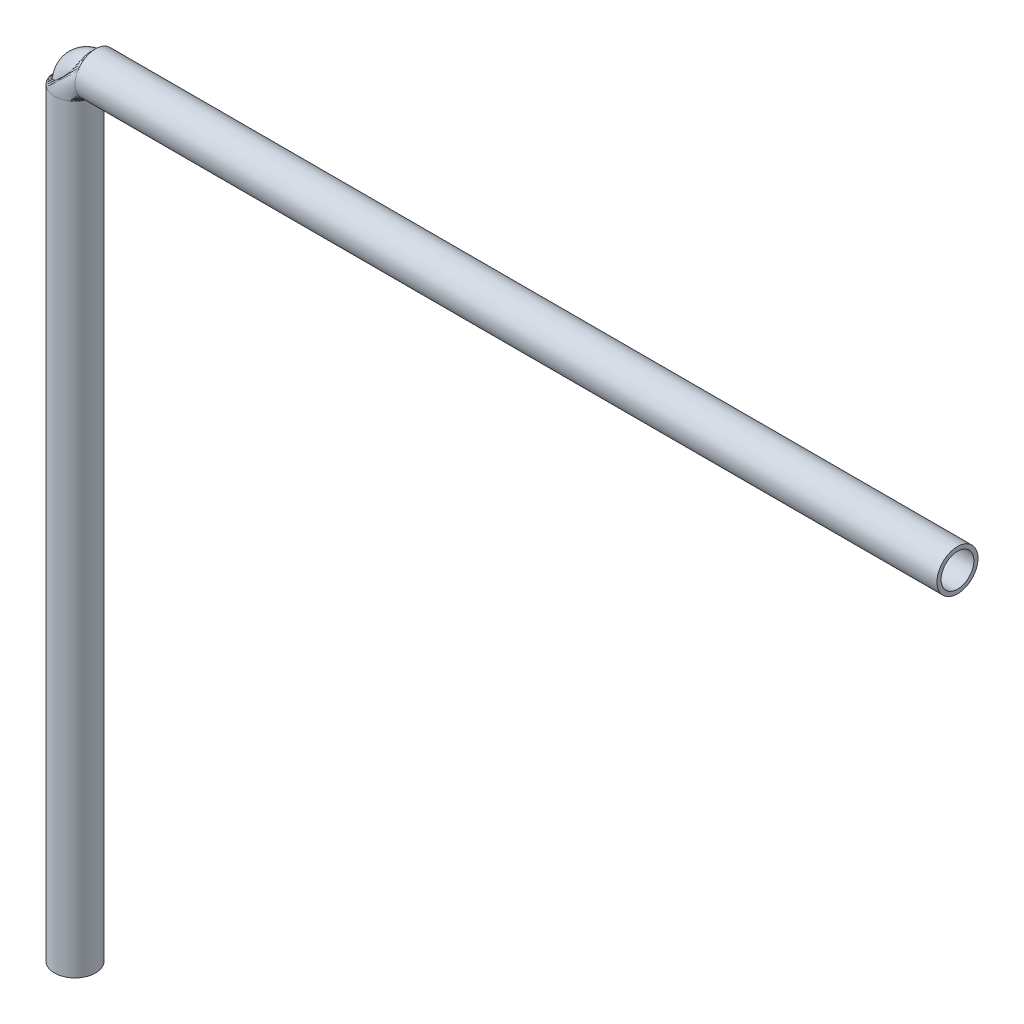
ISO-10303-21;
HEADER;
FILE_DESCRIPTION(('STEP AP214'),'2;1');
FILE_NAME('part.step','',(''),(''),'','','');
FILE_SCHEMA(('AUTOMOTIVE_DESIGN { 1 0 10303 214 1 1 1 1 }'));
ENDSEC;
DATA;
#1=APPLICATION_CONTEXT('core data for automotive mechanical design processes');
#2=APPLICATION_PROTOCOL_DEFINITION('international standard','automotive_design',2000,#1);
#3=PRODUCT_CONTEXT('',#1,'mechanical');
#4=PRODUCT('Part','Part','',(#3));
#5=PRODUCT_RELATED_PRODUCT_CATEGORY('part','',(#4));
#6=PRODUCT_DEFINITION_FORMATION('','',#4);
#7=PRODUCT_DEFINITION_CONTEXT('part definition',#1,'design');
#8=PRODUCT_DEFINITION('design','',#6,#7);
#9=PRODUCT_DEFINITION_SHAPE('','',#8);
#10=(LENGTH_UNIT() NAMED_UNIT(*) SI_UNIT(.MILLI.,.METRE.));
#11=(NAMED_UNIT(*) PLANE_ANGLE_UNIT() SI_UNIT($,.RADIAN.));
#12=(NAMED_UNIT(*) SI_UNIT($,.STERADIAN.) SOLID_ANGLE_UNIT());
#13=UNCERTAINTY_MEASURE_WITH_UNIT(LENGTH_MEASURE(1.E-05),#10,'distance_accuracy_value','');
#14=(GEOMETRIC_REPRESENTATION_CONTEXT(3) GLOBAL_UNCERTAINTY_ASSIGNED_CONTEXT((#13)) GLOBAL_UNIT_ASSIGNED_CONTEXT((#10,
#11,#12)) REPRESENTATION_CONTEXT('',''));
#15=CARTESIAN_POINT('',(0.,0.,0.));
#16=DIRECTION('',(0.,0.,1.));
#17=DIRECTION('',(1.,0.,0.));
#18=AXIS2_PLACEMENT_3D('',#15,#16,#17);
#19=CARTESIAN_POINT('',(0.,0.,0.));
#20=DIRECTION('',(0.,1.,0.));
#21=DIRECTION('',(0.,0.,1.));
#22=AXIS2_PLACEMENT_3D('',#19,#20,#21);
#23=CYLINDRICAL_SURFACE('',#22,0.5);
#24=CARTESIAN_POINT('',(0.,18.5,0.));
#25=DIRECTION('',(0.,1.,0.));
#26=DIRECTION('',(0.,0.,1.));
#27=AXIS2_PLACEMENT_3D('',#24,#25,#26);
#28=CIRCLE('',#27,0.5);
#29=CARTESIAN_POINT('',(0.5,18.5,0.));
#30=VERTEX_POINT('',#29);
#31=EDGE_CURVE('E65',#30,#30,#28,.T.);
#32=ORIENTED_EDGE('',*,*,#31,.F.);
#33=EDGE_LOOP('',(#32));
#34=FACE_BOUND('',#33,.T.);
#35=CARTESIAN_POINT('',(0.,0.,0.));
#36=DIRECTION('',(0.,1.,0.));
#37=DIRECTION('',(0.,0.,1.));
#38=AXIS2_PLACEMENT_3D('',#35,#36,#37);
#39=CIRCLE('',#38,0.5);
#40=CARTESIAN_POINT('',(0.,0.,0.5));
#41=VERTEX_POINT('',#40);
#42=EDGE_CURVE('E50',#41,#41,#39,.T.);
#43=ORIENTED_EDGE('',*,*,#42,.T.);
#44=EDGE_LOOP('',(#43));
#45=FACE_BOUND('',#44,.T.);
#46=ADVANCED_FACE('F35',(#34,#45),#23,.T.);
#47=CARTESIAN_POINT('',(0.5,18.5,0.));
#48=DIRECTION('',(0.,0.,-1.));
#49=DIRECTION('',(-1.,0.,0.));
#50=AXIS2_PLACEMENT_3D('',#47,#48,#49);
#51=TOROIDAL_SURFACE('',#50,0.5,0.5);
#52=CARTESIAN_POINT('',(0.5,19.,0.));
#53=DIRECTION('',(1.,0.,0.));
#54=DIRECTION('',(0.,0.,1.));
#55=AXIS2_PLACEMENT_3D('',#52,#53,#54);
#56=CIRCLE('',#55,0.5);
#57=EDGE_CURVE('E39',#30,#30,#56,.T.);
#58=ORIENTED_EDGE('',*,*,#57,.F.);
#59=ORIENTED_EDGE('',*,*,#31,.T.);
#60=EDGE_LOOP('',(#58,#59));
#61=FACE_BOUND('',#60,.T.);
#62=ADVANCED_FACE('F91',(#61),#51,.T.);
#63=CARTESIAN_POINT('',(0.5,19.,0.));
#64=DIRECTION('',(1.,0.,0.));
#65=DIRECTION('',(0.,0.,-1.));
#66=AXIS2_PLACEMENT_3D('',#63,#64,#65);
#67=CYLINDRICAL_SURFACE('',#66,0.5);
#68=CARTESIAN_POINT('',(21.5,19.,0.));
#69=DIRECTION('',(1.,0.,0.));
#70=DIRECTION('',(0.,0.,1.));
#71=AXIS2_PLACEMENT_3D('',#68,#69,#70);
#72=CIRCLE('',#71,0.5);
#73=CARTESIAN_POINT('',(21.5,19.,0.5));
#74=VERTEX_POINT('',#73);
#75=EDGE_CURVE('E56',#74,#74,#72,.T.);
#76=ORIENTED_EDGE('',*,*,#75,.F.);
#77=EDGE_LOOP('',(#76));
#78=FACE_BOUND('',#77,.T.);
#79=ORIENTED_EDGE('',*,*,#57,.T.);
#80=EDGE_LOOP('',(#79));
#81=FACE_BOUND('',#80,.T.);
#82=ADVANCED_FACE('F37',(#78,#81),#67,.T.);
#83=CARTESIAN_POINT('',(0.,0.,0.));
#84=DIRECTION('',(0.,1.,0.));
#85=DIRECTION('',(0.,0.,1.));
#86=AXIS2_PLACEMENT_3D('',#83,#84,#85);
#87=PLANE('',#86);
#88=CARTESIAN_POINT('',(0.,0.,0.));
#89=DIRECTION('',(0.,1.,0.));
#90=DIRECTION('',(0.,0.,1.));
#91=AXIS2_PLACEMENT_3D('',#88,#89,#90);
#92=CIRCLE('',#91,0.4);
#93=CARTESIAN_POINT('',(0.,0.,0.4));
#94=VERTEX_POINT('',#93);
#95=EDGE_CURVE('E82',#94,#94,#92,.F.);
#96=ORIENTED_EDGE('',*,*,#95,.F.);
#97=EDGE_LOOP('',(#96));
#98=FACE_BOUND('',#97,.T.);
#99=ORIENTED_EDGE('',*,*,#42,.F.);
#100=EDGE_LOOP('',(#99));
#101=FACE_BOUND('',#100,.T.);
#102=ADVANCED_FACE('F97',(#98,#101),#87,.F.);
#103=CARTESIAN_POINT('',(21.5,19.,0.));
#104=DIRECTION('',(1.,0.,0.));
#105=DIRECTION('',(0.,0.,1.));
#106=AXIS2_PLACEMENT_3D('',#103,#104,#105);
#107=PLANE('',#106);
#108=CARTESIAN_POINT('',(21.5,19.,0.));
#109=DIRECTION('',(1.,0.,0.));
#110=DIRECTION('',(0.,0.,1.));
#111=AXIS2_PLACEMENT_3D('',#108,#109,#110);
#112=CIRCLE('',#111,0.4);
#113=CARTESIAN_POINT('',(21.5,19.,0.4));
#114=VERTEX_POINT('',#113);
#115=EDGE_CURVE('E11',#114,#114,#112,.F.);
#116=ORIENTED_EDGE('',*,*,#115,.T.);
#117=EDGE_LOOP('',(#116));
#118=FACE_BOUND('',#117,.T.);
#119=ORIENTED_EDGE('',*,*,#75,.T.);
#120=EDGE_LOOP('',(#119));
#121=FACE_BOUND('',#120,.T.);
#122=ADVANCED_FACE('F68',(#118,#121),#107,.T.);
#123=CARTESIAN_POINT('',(0.,0.,0.));
#124=DIRECTION('',(0.,1.,0.));
#125=DIRECTION('',(0.,0.,1.));
#126=AXIS2_PLACEMENT_3D('',#123,#124,#125);
#127=CYLINDRICAL_SURFACE('',#126,0.4);
#128=CARTESIAN_POINT('',(0.,18.5,0.));
#129=DIRECTION('',(0.,1.,0.));
#130=DIRECTION('',(0.,0.,1.));
#131=AXIS2_PLACEMENT_3D('',#128,#129,#130);
#132=CIRCLE('',#131,0.4);
#133=CARTESIAN_POINT('',(-0.4,18.5,0.));
#134=VERTEX_POINT('',#133);
#135=EDGE_CURVE('E79',#134,#134,#132,.F.);
#136=ORIENTED_EDGE('',*,*,#135,.F.);
#137=EDGE_LOOP('',(#136));
#138=FACE_BOUND('',#137,.T.);
#139=ORIENTED_EDGE('',*,*,#95,.T.);
#140=EDGE_LOOP('',(#139));
#141=FACE_BOUND('',#140,.T.);
#142=ADVANCED_FACE('F104',(#138,#141),#127,.F.);
#143=CARTESIAN_POINT('',(0.5,18.5,0.));
#144=DIRECTION('',(0.,0.,-1.));
#145=DIRECTION('',(-1.,0.,0.));
#146=AXIS2_PLACEMENT_3D('',#143,#144,#145);
#147=TOROIDAL_SURFACE('',#146,0.5,0.4);
#148=CARTESIAN_POINT('',(0.5,19.,0.));
#149=DIRECTION('',(1.,0.,0.));
#150=DIRECTION('',(0.,0.,1.));
#151=AXIS2_PLACEMENT_3D('',#148,#149,#150);
#152=CIRCLE('',#151,0.4);
#153=CARTESIAN_POINT('',(0.5,19.4,0.));
#154=VERTEX_POINT('',#153);
#155=EDGE_CURVE('E44',#154,#154,#152,.F.);
#156=CARTESIAN_POINT('',(0.5,18.5,0.));
#157=DIRECTION('',(0.,0.,-1.));
#158=DIRECTION('',(-1.,0.,0.));
#159=AXIS2_PLACEMENT_3D('',#156,#157,#158);
#160=CIRCLE('',#159,0.9);
#161=EDGE_CURVE('',#134,#154,#160,.T.);
#162=ORIENTED_EDGE('',*,*,#135,.T.);
#163=ORIENTED_EDGE('',*,*,#155,.F.);
#164=ORIENTED_EDGE('',*,*,#161,.T.);
#165=ORIENTED_EDGE('',*,*,#161,.F.);
#166=EDGE_LOOP('',(#162,#164,#163,#165));
#167=FACE_BOUND('',#166,.T.);
#168=ADVANCED_FACE('F74',(#167),#147,.F.);
#169=CARTESIAN_POINT('',(0.5,19.,0.));
#170=DIRECTION('',(1.,0.,0.));
#171=DIRECTION('',(0.,0.,-1.));
#172=AXIS2_PLACEMENT_3D('',#169,#170,#171);
#173=CYLINDRICAL_SURFACE('',#172,0.4);
#174=ORIENTED_EDGE('',*,*,#115,.F.);
#175=EDGE_LOOP('',(#174));
#176=FACE_BOUND('',#175,.T.);
#177=ORIENTED_EDGE('',*,*,#155,.T.);
#178=EDGE_LOOP('',(#177));
#179=FACE_BOUND('',#178,.T.);
#180=ADVANCED_FACE('F71',(#176,#179),#173,.F.);
#181=CLOSED_SHELL('',(#46,#62,#82,#102,#122,#142,#168,#180));
#182=MANIFOLD_SOLID_BREP('B2',#181);
#183=ADVANCED_BREP_SHAPE_REPRESENTATION('',(#18,#182),#14);
#184=SHAPE_DEFINITION_REPRESENTATION(#9,#183);
ENDSEC;
END-ISO-10303-21;
